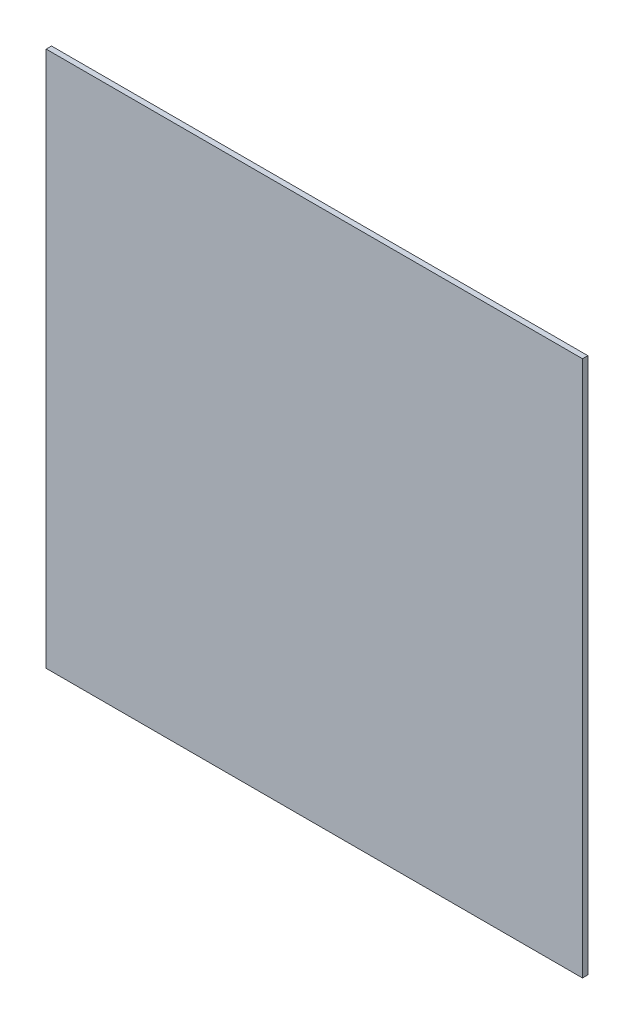
ISO-10303-21;
HEADER;
FILE_DESCRIPTION(('STEP AP214'),'2;1');
FILE_NAME('part.step','',(''),(''),'','','');
FILE_SCHEMA(('AUTOMOTIVE_DESIGN { 1 0 10303 214 1 1 1 1 }'));
ENDSEC;
DATA;
#1=APPLICATION_CONTEXT('core data for automotive mechanical design processes');
#2=APPLICATION_PROTOCOL_DEFINITION('international standard','automotive_design',2000,#1);
#3=PRODUCT_CONTEXT('',#1,'mechanical');
#4=PRODUCT('Part','Part','',(#3));
#5=PRODUCT_RELATED_PRODUCT_CATEGORY('part','',(#4));
#6=PRODUCT_DEFINITION_FORMATION('','',#4);
#7=PRODUCT_DEFINITION_CONTEXT('part definition',#1,'design');
#8=PRODUCT_DEFINITION('design','',#6,#7);
#9=PRODUCT_DEFINITION_SHAPE('','',#8);
#10=(LENGTH_UNIT() NAMED_UNIT(*) SI_UNIT(.MILLI.,.METRE.));
#11=(NAMED_UNIT(*) PLANE_ANGLE_UNIT() SI_UNIT($,.RADIAN.));
#12=(NAMED_UNIT(*) SI_UNIT($,.STERADIAN.) SOLID_ANGLE_UNIT());
#13=UNCERTAINTY_MEASURE_WITH_UNIT(LENGTH_MEASURE(1.E-05),#10,'distance_accuracy_value','');
#14=(GEOMETRIC_REPRESENTATION_CONTEXT(3) GLOBAL_UNCERTAINTY_ASSIGNED_CONTEXT((#13)) GLOBAL_UNIT_ASSIGNED_CONTEXT((#10,
#11,#12)) REPRESENTATION_CONTEXT('',''));
#15=CARTESIAN_POINT('',(0.,0.,0.));
#16=DIRECTION('',(0.,0.,1.));
#17=DIRECTION('',(1.,0.,0.));
#18=AXIS2_PLACEMENT_3D('',#15,#16,#17);
#19=CARTESIAN_POINT('',(5000.,-5000.,100.));
#20=DIRECTION('',(-1.,0.,0.));
#21=DIRECTION('',(0.,0.,1.));
#22=AXIS2_PLACEMENT_3D('',#19,#20,#21);
#23=PLANE('',#22);
#24=DIRECTION('',(0.,1.,0.));
#25=VECTOR('',#24,1.);
#26=CARTESIAN_POINT('',(5000.,-5000.,0.));
#27=LINE('',#26,#25);
#28=CARTESIAN_POINT('',(5000.,-5000.,0.));
#29=VERTEX_POINT('',#28);
#30=CARTESIAN_POINT('',(5000.,5000.,0.));
#31=VERTEX_POINT('',#30);
#32=EDGE_CURVE('E99',#29,#31,#27,.T.);
#33=ORIENTED_EDGE('',*,*,#32,.T.);
#34=DIRECTION('',(0.,0.,-1.));
#35=VECTOR('',#34,1.);
#36=CARTESIAN_POINT('',(5000.,5000.,100.));
#37=LINE('',#36,#35);
#38=CARTESIAN_POINT('',(5000.,5000.,100.));
#39=VERTEX_POINT('',#38);
#40=EDGE_CURVE('E11',#39,#31,#37,.T.);
#41=ORIENTED_EDGE('',*,*,#40,.F.);
#42=DIRECTION('',(0.,1.,0.));
#43=VECTOR('',#42,1.);
#44=CARTESIAN_POINT('',(5000.,-5000.,100.));
#45=LINE('',#44,#43);
#46=CARTESIAN_POINT('',(5000.,-5000.,100.));
#47=VERTEX_POINT('',#46);
#48=EDGE_CURVE('E87',#47,#39,#45,.T.);
#49=ORIENTED_EDGE('',*,*,#48,.F.);
#50=DIRECTION('',(0.,0.,-1.));
#51=VECTOR('',#50,1.);
#52=CARTESIAN_POINT('',(5000.,-5000.,100.));
#53=LINE('',#52,#51);
#54=EDGE_CURVE('E95',#47,#29,#53,.T.);
#55=ORIENTED_EDGE('',*,*,#54,.T.);
#56=EDGE_LOOP('',(#33,#41,#49,#55));
#57=FACE_BOUND('',#56,.T.);
#58=ADVANCED_FACE('F36',(#57),#23,.F.);
#59=CARTESIAN_POINT('',(-5000.,5000.,100.));
#60=DIRECTION('',(0.,-1.,0.));
#61=DIRECTION('',(0.,0.,-1.));
#62=AXIS2_PLACEMENT_3D('',#59,#60,#61);
#63=PLANE('',#62);
#64=DIRECTION('',(-1.,0.,0.));
#65=VECTOR('',#64,1.);
#66=CARTESIAN_POINT('',(-5000.,5000.,0.));
#67=LINE('',#66,#65);
#68=CARTESIAN_POINT('',(-5000.,5000.,0.));
#69=VERTEX_POINT('',#68);
#70=EDGE_CURVE('E91',#31,#69,#67,.T.);
#71=ORIENTED_EDGE('',*,*,#70,.T.);
#72=DIRECTION('',(0.,0.,-1.));
#73=VECTOR('',#72,1.);
#74=CARTESIAN_POINT('',(-5000.,5000.,100.));
#75=LINE('',#74,#73);
#76=CARTESIAN_POINT('',(-5000.,5000.,100.));
#77=VERTEX_POINT('',#76);
#78=EDGE_CURVE('E44',#77,#69,#75,.T.);
#79=ORIENTED_EDGE('',*,*,#78,.F.);
#80=DIRECTION('',(-1.,0.,0.));
#81=VECTOR('',#80,1.);
#82=CARTESIAN_POINT('',(-5000.,5000.,100.));
#83=LINE('',#82,#81);
#84=EDGE_CURVE('E82',#39,#77,#83,.T.);
#85=ORIENTED_EDGE('',*,*,#84,.F.);
#86=ORIENTED_EDGE('',*,*,#40,.T.);
#87=EDGE_LOOP('',(#71,#79,#85,#86));
#88=FACE_BOUND('',#87,.T.);
#89=ADVANCED_FACE('F90',(#88),#63,.F.);
#90=CARTESIAN_POINT('',(-5000.,-5000.,100.));
#91=DIRECTION('',(1.,0.,0.));
#92=DIRECTION('',(0.,0.,-1.));
#93=AXIS2_PLACEMENT_3D('',#90,#91,#92);
#94=PLANE('',#93);
#95=DIRECTION('',(0.,-1.,0.));
#96=VECTOR('',#95,1.);
#97=CARTESIAN_POINT('',(-5000.,-5000.,0.));
#98=LINE('',#97,#96);
#99=CARTESIAN_POINT('',(-5000.,-5000.,0.));
#100=VERTEX_POINT('',#99);
#101=EDGE_CURVE('E69',#69,#100,#98,.T.);
#102=ORIENTED_EDGE('',*,*,#101,.T.);
#103=DIRECTION('',(0.,0.,-1.));
#104=VECTOR('',#103,1.);
#105=CARTESIAN_POINT('',(-5000.,-5000.,100.));
#106=LINE('',#105,#104);
#107=CARTESIAN_POINT('',(-5000.,-5000.,100.));
#108=VERTEX_POINT('',#107);
#109=EDGE_CURVE('E92',#108,#100,#106,.T.);
#110=ORIENTED_EDGE('',*,*,#109,.F.);
#111=DIRECTION('',(0.,-1.,0.));
#112=VECTOR('',#111,1.);
#113=CARTESIAN_POINT('',(-5000.,-5000.,100.));
#114=LINE('',#113,#112);
#115=EDGE_CURVE('E85',#77,#108,#114,.T.);
#116=ORIENTED_EDGE('',*,*,#115,.F.);
#117=ORIENTED_EDGE('',*,*,#78,.T.);
#118=EDGE_LOOP('',(#102,#110,#116,#117));
#119=FACE_BOUND('',#118,.T.);
#120=ADVANCED_FACE('F93',(#119),#94,.F.);
#121=CARTESIAN_POINT('',(-5000.,-5000.,100.));
#122=DIRECTION('',(0.,1.,0.));
#123=DIRECTION('',(0.,0.,1.));
#124=AXIS2_PLACEMENT_3D('',#121,#122,#123);
#125=PLANE('',#124);
#126=DIRECTION('',(1.,0.,0.));
#127=VECTOR('',#126,1.);
#128=CARTESIAN_POINT('',(-5000.,-5000.,0.));
#129=LINE('',#128,#127);
#130=EDGE_CURVE('E75',#100,#29,#129,.T.);
#131=ORIENTED_EDGE('',*,*,#130,.T.);
#132=ORIENTED_EDGE('',*,*,#54,.F.);
#133=DIRECTION('',(1.,0.,0.));
#134=VECTOR('',#133,1.);
#135=CARTESIAN_POINT('',(-5000.,-5000.,100.));
#136=LINE('',#135,#134);
#137=EDGE_CURVE('E52',#108,#47,#136,.T.);
#138=ORIENTED_EDGE('',*,*,#137,.F.);
#139=ORIENTED_EDGE('',*,*,#109,.T.);
#140=EDGE_LOOP('',(#131,#132,#138,#139));
#141=FACE_BOUND('',#140,.T.);
#142=ADVANCED_FACE('F106',(#141),#125,.F.);
#143=CARTESIAN_POINT('',(0.,0.,100.));
#144=DIRECTION('',(0.,0.,-1.));
#145=DIRECTION('',(-1.,0.,0.));
#146=AXIS2_PLACEMENT_3D('',#143,#144,#145);
#147=PLANE('',#146);
#148=ORIENTED_EDGE('',*,*,#48,.T.);
#149=ORIENTED_EDGE('',*,*,#84,.T.);
#150=ORIENTED_EDGE('',*,*,#115,.T.);
#151=ORIENTED_EDGE('',*,*,#137,.T.);
#152=EDGE_LOOP('',(#148,#149,#150,#151));
#153=FACE_BOUND('',#152,.T.);
#154=ADVANCED_FACE('F83',(#153),#147,.F.);
#155=CARTESIAN_POINT('',(0.,0.,0.));
#156=DIRECTION('',(0.,0.,-1.));
#157=DIRECTION('',(-1.,0.,0.));
#158=AXIS2_PLACEMENT_3D('',#155,#156,#157);
#159=PLANE('',#158);
#160=ORIENTED_EDGE('',*,*,#32,.F.);
#161=ORIENTED_EDGE('',*,*,#130,.F.);
#162=ORIENTED_EDGE('',*,*,#101,.F.);
#163=ORIENTED_EDGE('',*,*,#70,.F.);
#164=EDGE_LOOP('',(#160,#161,#162,#163));
#165=FACE_BOUND('',#164,.T.);
#166=ADVANCED_FACE('F109',(#165),#159,.T.);
#167=CLOSED_SHELL('',(#58,#89,#120,#142,#154,#166));
#168=MANIFOLD_SOLID_BREP('B2',#167);
#169=ADVANCED_BREP_SHAPE_REPRESENTATION('',(#18,#168),#14);
#170=SHAPE_DEFINITION_REPRESENTATION(#9,#169);
ENDSEC;
END-ISO-10303-21;
